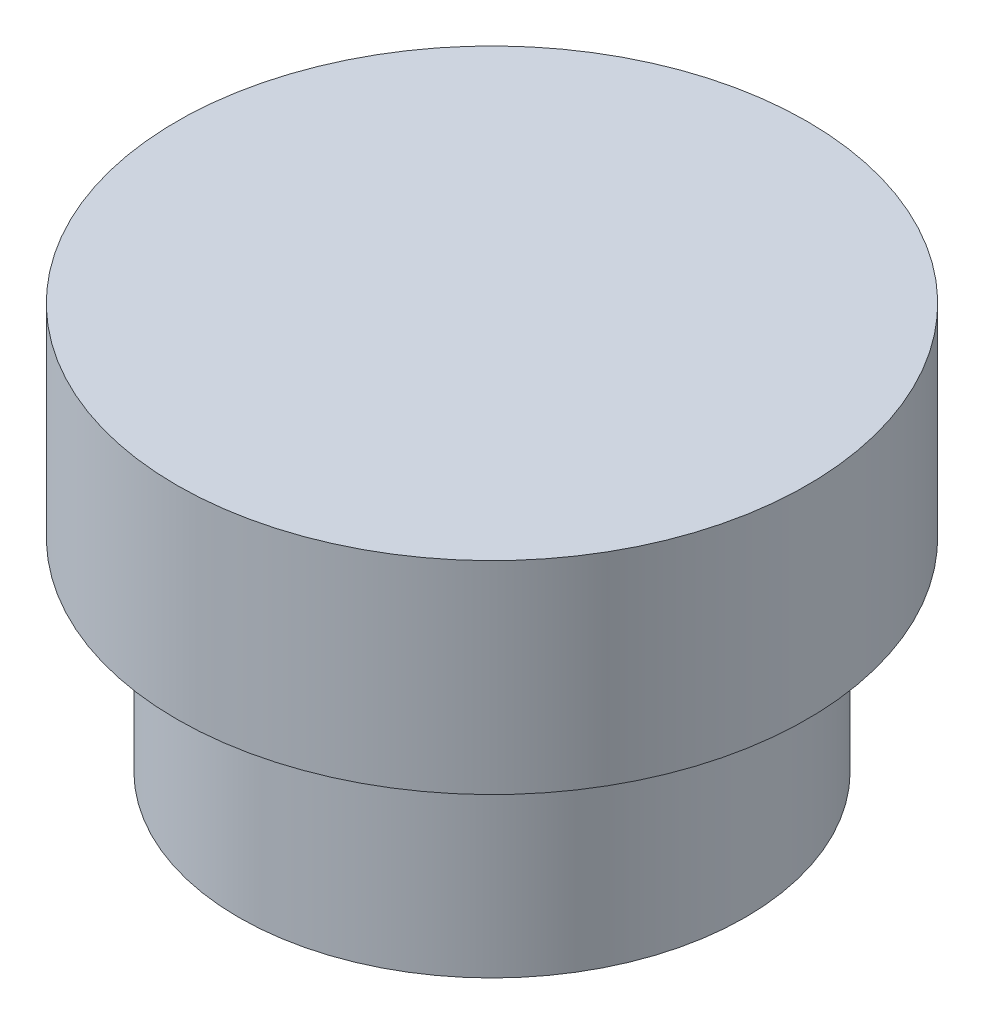
ISO-10303-21;
HEADER;
FILE_DESCRIPTION(('STEP AP214'),'2;1');
FILE_NAME('part.step','',(''),(''),'','','');
FILE_SCHEMA(('AUTOMOTIVE_DESIGN { 1 0 10303 214 1 1 1 1 }'));
ENDSEC;
DATA;
#1=APPLICATION_CONTEXT('core data for automotive mechanical design processes');
#2=APPLICATION_PROTOCOL_DEFINITION('international standard','automotive_design',2000,#1);
#3=PRODUCT_CONTEXT('',#1,'mechanical');
#4=PRODUCT('Part','Part','',(#3));
#5=PRODUCT_RELATED_PRODUCT_CATEGORY('part','',(#4));
#6=PRODUCT_DEFINITION_FORMATION('','',#4);
#7=PRODUCT_DEFINITION_CONTEXT('part definition',#1,'design');
#8=PRODUCT_DEFINITION('design','',#6,#7);
#9=PRODUCT_DEFINITION_SHAPE('','',#8);
#10=(LENGTH_UNIT() NAMED_UNIT(*) SI_UNIT(.MILLI.,.METRE.));
#11=(NAMED_UNIT(*) PLANE_ANGLE_UNIT() SI_UNIT($,.RADIAN.));
#12=(NAMED_UNIT(*) SI_UNIT($,.STERADIAN.) SOLID_ANGLE_UNIT());
#13=UNCERTAINTY_MEASURE_WITH_UNIT(LENGTH_MEASURE(1.E-05),#10,'distance_accuracy_value','');
#14=(GEOMETRIC_REPRESENTATION_CONTEXT(3) GLOBAL_UNCERTAINTY_ASSIGNED_CONTEXT((#13)) GLOBAL_UNIT_ASSIGNED_CONTEXT((#10,
#11,#12)) REPRESENTATION_CONTEXT('',''));
#15=CARTESIAN_POINT('',(0.,0.,0.));
#16=DIRECTION('',(0.,0.,1.));
#17=DIRECTION('',(1.,0.,0.));
#18=AXIS2_PLACEMENT_3D('',#15,#16,#17);
#19=CARTESIAN_POINT('',(0.,0.,0.));
#20=DIRECTION('',(0.,1.,0.));
#21=DIRECTION('',(0.,0.,1.));
#22=AXIS2_PLACEMENT_3D('',#19,#20,#21);
#23=PLANE('',#22);
#24=CARTESIAN_POINT('',(0.,0.,0.));
#25=DIRECTION('',(0.,1.,0.));
#26=DIRECTION('',(0.,0.,1.));
#27=AXIS2_PLACEMENT_3D('',#24,#25,#26);
#28=CIRCLE('',#27,14.);
#29=CARTESIAN_POINT('',(0.,0.,14.));
#30=VERTEX_POINT('',#29);
#31=EDGE_CURVE('E42',#30,#30,#28,.T.);
#32=ORIENTED_EDGE('',*,*,#31,.F.);
#33=EDGE_LOOP('',(#32));
#34=FACE_BOUND('',#33,.T.);
#35=CARTESIAN_POINT('',(0.,0.,0.));
#36=DIRECTION('',(0.,1.,0.));
#37=DIRECTION('',(0.,0.,1.));
#38=AXIS2_PLACEMENT_3D('',#35,#36,#37);
#39=CIRCLE('',#38,11.25);
#40=CARTESIAN_POINT('',(0.,0.,11.25));
#41=VERTEX_POINT('',#40);
#42=EDGE_CURVE('E10',#41,#41,#39,.F.);
#43=ORIENTED_EDGE('',*,*,#42,.F.);
#44=EDGE_LOOP('',(#43));
#45=FACE_BOUND('',#44,.T.);
#46=ADVANCED_FACE('F31',(#34,#45),#23,.F.);
#47=CARTESIAN_POINT('',(0.,9.,0.));
#48=DIRECTION('',(0.,-1.,0.));
#49=DIRECTION('',(0.,0.,-1.));
#50=AXIS2_PLACEMENT_3D('',#47,#48,#49);
#51=CYLINDRICAL_SURFACE('',#50,14.);
#52=CARTESIAN_POINT('',(0.,9.,0.));
#53=DIRECTION('',(0.,1.,0.));
#54=DIRECTION('',(0.,0.,1.));
#55=AXIS2_PLACEMENT_3D('',#52,#53,#54);
#56=CIRCLE('',#55,14.);
#57=CARTESIAN_POINT('',(0.,9.,14.));
#58=VERTEX_POINT('',#57);
#59=EDGE_CURVE('E38',#58,#58,#56,.T.);
#60=ORIENTED_EDGE('',*,*,#59,.F.);
#61=EDGE_LOOP('',(#60));
#62=FACE_BOUND('',#61,.T.);
#63=ORIENTED_EDGE('',*,*,#31,.T.);
#64=EDGE_LOOP('',(#63));
#65=FACE_BOUND('',#64,.T.);
#66=ADVANCED_FACE('F33',(#62,#65),#51,.T.);
#67=CARTESIAN_POINT('',(0.,9.,0.));
#68=DIRECTION('',(0.,1.,0.));
#69=DIRECTION('',(0.,0.,1.));
#70=AXIS2_PLACEMENT_3D('',#67,#68,#69);
#71=PLANE('',#70);
#72=ORIENTED_EDGE('',*,*,#59,.T.);
#73=EDGE_LOOP('',(#72));
#74=FACE_BOUND('',#73,.T.);
#75=ADVANCED_FACE('F56',(#74),#71,.T.);
#76=CARTESIAN_POINT('',(0.,-9.,0.));
#77=DIRECTION('',(0.,1.,0.));
#78=DIRECTION('',(0.,0.,1.));
#79=AXIS2_PLACEMENT_3D('',#76,#77,#78);
#80=CYLINDRICAL_SURFACE('',#79,11.25);
#81=CARTESIAN_POINT('',(0.,-9.,0.));
#82=DIRECTION('',(0.,-1.,0.));
#83=DIRECTION('',(0.,0.,-1.));
#84=AXIS2_PLACEMENT_3D('',#81,#82,#83);
#85=CIRCLE('',#84,11.25);
#86=CARTESIAN_POINT('',(0.,-9.,-11.25));
#87=VERTEX_POINT('',#86);
#88=EDGE_CURVE('E46',#87,#87,#85,.T.);
#89=ORIENTED_EDGE('',*,*,#88,.F.);
#90=EDGE_LOOP('',(#89));
#91=FACE_BOUND('',#90,.T.);
#92=ORIENTED_EDGE('',*,*,#42,.T.);
#93=EDGE_LOOP('',(#92));
#94=FACE_BOUND('',#93,.T.);
#95=ADVANCED_FACE('F54',(#91,#94),#80,.T.);
#96=CARTESIAN_POINT('',(0.,-9.,0.));
#97=DIRECTION('',(0.,-1.,0.));
#98=DIRECTION('',(0.,0.,-1.));
#99=AXIS2_PLACEMENT_3D('',#96,#97,#98);
#100=PLANE('',#99);
#101=ORIENTED_EDGE('',*,*,#88,.T.);
#102=EDGE_LOOP('',(#101));
#103=FACE_BOUND('',#102,.T.);
#104=ADVANCED_FACE('F52',(#103),#100,.T.);
#105=CLOSED_SHELL('',(#46,#66,#75,#95,#104));
#106=MANIFOLD_SOLID_BREP('B2',#105);
#107=ADVANCED_BREP_SHAPE_REPRESENTATION('',(#18,#106),#14);
#108=SHAPE_DEFINITION_REPRESENTATION(#9,#107);
ENDSEC;
END-ISO-10303-21;
